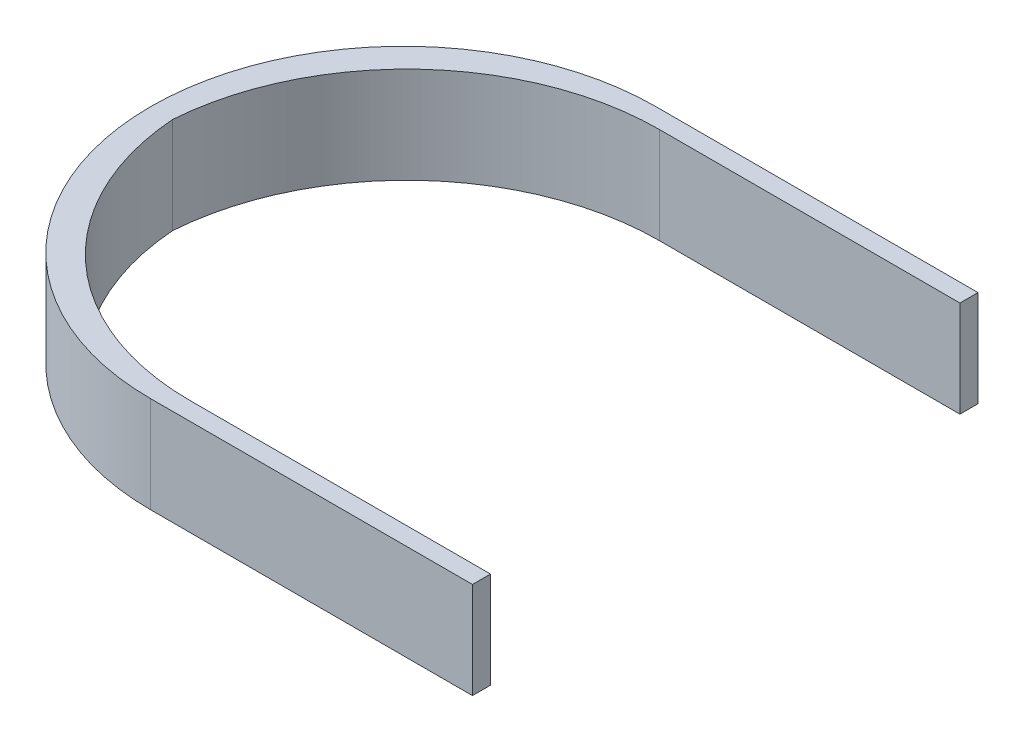
ISO-10303-21;
HEADER;
FILE_DESCRIPTION(('STEP AP214'),'2;1');
FILE_NAME('part.step','',(''),(''),'','','');
FILE_SCHEMA(('AUTOMOTIVE_DESIGN { 1 0 10303 214 1 1 1 1 }'));
ENDSEC;
DATA;
#1=APPLICATION_CONTEXT('core data for automotive mechanical design processes');
#2=APPLICATION_PROTOCOL_DEFINITION('international standard','automotive_design',2000,#1);
#3=PRODUCT_CONTEXT('',#1,'mechanical');
#4=PRODUCT('Part','Part','',(#3));
#5=PRODUCT_RELATED_PRODUCT_CATEGORY('part','',(#4));
#6=PRODUCT_DEFINITION_FORMATION('','',#4);
#7=PRODUCT_DEFINITION_CONTEXT('part definition',#1,'design');
#8=PRODUCT_DEFINITION('design','',#6,#7);
#9=PRODUCT_DEFINITION_SHAPE('','',#8);
#10=(LENGTH_UNIT() NAMED_UNIT(*) SI_UNIT(.MILLI.,.METRE.));
#11=(NAMED_UNIT(*) PLANE_ANGLE_UNIT() SI_UNIT($,.RADIAN.));
#12=(NAMED_UNIT(*) SI_UNIT($,.STERADIAN.) SOLID_ANGLE_UNIT());
#13=UNCERTAINTY_MEASURE_WITH_UNIT(LENGTH_MEASURE(1.E-05),#10,'distance_accuracy_value','');
#14=(GEOMETRIC_REPRESENTATION_CONTEXT(3) GLOBAL_UNCERTAINTY_ASSIGNED_CONTEXT((#13)) GLOBAL_UNIT_ASSIGNED_CONTEXT((#10,
#11,#12)) REPRESENTATION_CONTEXT('',''));
#15=CARTESIAN_POINT('',(0.,0.,0.));
#16=DIRECTION('',(0.,0.,1.));
#17=DIRECTION('',(1.,0.,0.));
#18=AXIS2_PLACEMENT_3D('',#15,#16,#17);
#19=CARTESIAN_POINT('',(0.,8.,0.));
#20=DIRECTION('',(0.,0.,-1.));
#21=DIRECTION('',(-1.,0.,0.));
#22=AXIS2_PLACEMENT_3D('',#19,#20,#21);
#23=PLANE('',#22);
#24=DIRECTION('',(1.,0.,0.));
#25=VECTOR('',#24,1.);
#26=CARTESIAN_POINT('',(0.,0.,0.));
#27=LINE('',#26,#25);
#28=CARTESIAN_POINT('',(21.,0.,0.));
#29=VERTEX_POINT('',#28);
#30=CARTESIAN_POINT('',(47.7496507037714,0.,0.));
#31=VERTEX_POINT('',#30);
#32=EDGE_CURVE('E153',#29,#31,#27,.T.);
#33=ORIENTED_EDGE('',*,*,#32,.T.);
#34=DIRECTION('',(0.,1.,0.));
#35=VECTOR('',#34,1.);
#36=CARTESIAN_POINT('',(47.7496507037714,8.,0.));
#37=LINE('',#36,#35);
#38=CARTESIAN_POINT('',(47.7496507037714,8.,0.));
#39=VERTEX_POINT('',#38);
#40=EDGE_CURVE('E123',#31,#39,#37,.T.);
#41=ORIENTED_EDGE('',*,*,#40,.T.);
#42=DIRECTION('',(1.,0.,0.));
#43=VECTOR('',#42,1.);
#44=CARTESIAN_POINT('',(0.,8.,0.));
#45=LINE('',#44,#43);
#46=CARTESIAN_POINT('',(21.,8.,0.));
#47=VERTEX_POINT('',#46);
#48=EDGE_CURVE('E142',#47,#39,#45,.T.);
#49=ORIENTED_EDGE('',*,*,#48,.F.);
#50=DIRECTION('',(0.,-1.,0.));
#51=VECTOR('',#50,1.);
#52=CARTESIAN_POINT('',(21.,0.,0.));
#53=LINE('',#52,#51);
#54=EDGE_CURVE('E162',#47,#29,#53,.T.);
#55=ORIENTED_EDGE('',*,*,#54,.T.);
#56=EDGE_LOOP('',(#33,#41,#49,#55));
#57=FACE_BOUND('',#56,.T.);
#58=ADVANCED_FACE('F39',(#57),#23,.F.);
#59=CARTESIAN_POINT('',(0.,8.,-42.));
#60=DIRECTION('',(0.,0.,-1.));
#61=DIRECTION('',(-1.,0.,0.));
#62=AXIS2_PLACEMENT_3D('',#59,#60,#61);
#63=PLANE('',#62);
#64=DIRECTION('',(0.,1.,0.));
#65=VECTOR('',#64,1.);
#66=CARTESIAN_POINT('',(47.7496507037714,8.,-42.));
#67=LINE('',#66,#65);
#68=CARTESIAN_POINT('',(47.7496507037714,0.,-42.));
#69=VERTEX_POINT('',#68);
#70=CARTESIAN_POINT('',(47.7496507037714,8.,-42.));
#71=VERTEX_POINT('',#70);
#72=EDGE_CURVE('E114',#69,#71,#67,.T.);
#73=ORIENTED_EDGE('',*,*,#72,.F.);
#74=DIRECTION('',(1.,0.,0.));
#75=VECTOR('',#74,1.);
#76=CARTESIAN_POINT('',(0.,0.,-42.));
#77=LINE('',#76,#75);
#78=CARTESIAN_POINT('',(21.,0.,-42.));
#79=VERTEX_POINT('',#78);
#80=EDGE_CURVE('E149',#79,#69,#77,.T.);
#81=ORIENTED_EDGE('',*,*,#80,.F.);
#82=DIRECTION('',(0.,-1.,0.));
#83=VECTOR('',#82,1.);
#84=CARTESIAN_POINT('',(21.,8.,-42.));
#85=LINE('',#84,#83);
#86=CARTESIAN_POINT('',(21.,8.,-42.));
#87=VERTEX_POINT('',#86);
#88=EDGE_CURVE('E139',#79,#87,#85,.F.);
#89=ORIENTED_EDGE('',*,*,#88,.T.);
#90=DIRECTION('',(1.,0.,0.));
#91=VECTOR('',#90,1.);
#92=CARTESIAN_POINT('',(0.,8.,-42.));
#93=LINE('',#92,#91);
#94=EDGE_CURVE('E130',#87,#71,#93,.T.);
#95=ORIENTED_EDGE('',*,*,#94,.T.);
#96=EDGE_LOOP('',(#73,#81,#89,#95));
#97=FACE_BOUND('',#96,.T.);
#98=ADVANCED_FACE('F137',(#97),#63,.T.);
#99=CARTESIAN_POINT('',(0.,8.,0.));
#100=DIRECTION('',(0.,1.,0.));
#101=DIRECTION('',(0.,0.,1.));
#102=AXIS2_PLACEMENT_3D('',#99,#100,#101);
#103=PLANE('',#102);
#104=DIRECTION('',(0.,0.,1.));
#105=VECTOR('',#104,1.);
#106=CARTESIAN_POINT('',(47.7496507037714,8.,-43.2267733965463));
#107=LINE('',#106,#105);
#108=CARTESIAN_POINT('',(47.7496507037714,8.,-40.5));
#109=VERTEX_POINT('',#108);
#110=EDGE_CURVE('E55',#71,#109,#107,.T.);
#111=ORIENTED_EDGE('',*,*,#110,.F.);
#112=ORIENTED_EDGE('',*,*,#94,.F.);
#113=CARTESIAN_POINT('',(21.,8.,-21.));
#114=DIRECTION('',(0.,1.,0.));
#115=DIRECTION('',(0.,0.,1.));
#116=AXIS2_PLACEMENT_3D('',#113,#114,#115);
#117=CIRCLE('',#116,21.);
#118=CARTESIAN_POINT('',(0.,8.,-21.));
#119=VERTEX_POINT('',#118);
#120=EDGE_CURVE('E195',#87,#119,#117,.T.);
#121=ORIENTED_EDGE('',*,*,#120,.T.);
#122=CARTESIAN_POINT('',(21.,8.,-21.));
#123=DIRECTION('',(0.,1.,0.));
#124=DIRECTION('',(0.,0.,1.));
#125=AXIS2_PLACEMENT_3D('',#122,#123,#124);
#126=CIRCLE('',#125,21.);
#127=EDGE_CURVE('E48',#119,#47,#126,.T.);
#128=ORIENTED_EDGE('',*,*,#127,.T.);
#129=ORIENTED_EDGE('',*,*,#48,.T.);
#130=CARTESIAN_POINT('',(47.7496507037714,8.,-1.5));
#131=VERTEX_POINT('',#130);
#132=EDGE_CURVE('E135',#131,#39,#107,.T.);
#133=ORIENTED_EDGE('',*,*,#132,.F.);
#134=DIRECTION('',(1.,0.,0.));
#135=VECTOR('',#134,1.);
#136=CARTESIAN_POINT('',(1.7857142857143,8.,-1.5));
#137=LINE('',#136,#135);
#138=CARTESIAN_POINT('',(22.7857142857143,8.,-1.5));
#139=VERTEX_POINT('',#138);
#140=EDGE_CURVE('E157',#139,#131,#137,.T.);
#141=ORIENTED_EDGE('',*,*,#140,.F.);
#142=CARTESIAN_POINT('',(22.7857142857143,8.,-22.5));
#143=DIRECTION('',(0.,1.,0.));
#144=DIRECTION('',(0.,0.,1.));
#145=AXIS2_PLACEMENT_3D('',#142,#143,#144);
#146=CIRCLE('',#145,21.);
#147=CARTESIAN_POINT('',(1.83935422006089,8.,-21.));
#148=VERTEX_POINT('',#147);
#149=EDGE_CURVE('E180',#139,#148,#146,.F.);
#150=ORIENTED_EDGE('',*,*,#149,.T.);
#151=CARTESIAN_POINT('',(22.7857142857143,8.,-19.5));
#152=DIRECTION('',(0.,1.,0.));
#153=DIRECTION('',(0.,0.,1.));
#154=AXIS2_PLACEMENT_3D('',#151,#152,#153);
#155=CIRCLE('',#154,21.);
#156=CARTESIAN_POINT('',(22.7857142857143,8.,-40.5));
#157=VERTEX_POINT('',#156);
#158=EDGE_CURVE('E186',#148,#157,#155,.F.);
#159=ORIENTED_EDGE('',*,*,#158,.T.);
#160=DIRECTION('',(1.,0.,0.));
#161=VECTOR('',#160,1.);
#162=CARTESIAN_POINT('',(1.7857142857143,8.,-40.5));
#163=LINE('',#162,#161);
#164=EDGE_CURVE('E133',#157,#109,#163,.T.);
#165=ORIENTED_EDGE('',*,*,#164,.T.);
#166=EDGE_LOOP('',(#111,#112,#121,#128,#129,#133,#141,#150,#159,#165));
#167=FACE_BOUND('',#166,.T.);
#168=ADVANCED_FACE('F129',(#167),#103,.T.);
#169=CARTESIAN_POINT('',(0.,0.,0.));
#170=DIRECTION('',(0.,1.,0.));
#171=DIRECTION('',(0.,0.,1.));
#172=AXIS2_PLACEMENT_3D('',#169,#170,#171);
#173=PLANE('',#172);
#174=ORIENTED_EDGE('',*,*,#80,.T.);
#175=DIRECTION('',(0.,0.,1.));
#176=VECTOR('',#175,1.);
#177=CARTESIAN_POINT('',(47.7496507037714,0.,-43.2267733965463));
#178=LINE('',#177,#176);
#179=CARTESIAN_POINT('',(47.7496507037714,0.,-40.5));
#180=VERTEX_POINT('',#179);
#181=EDGE_CURVE('E117',#69,#180,#178,.T.);
#182=ORIENTED_EDGE('',*,*,#181,.T.);
#183=DIRECTION('',(-1.,0.,0.));
#184=VECTOR('',#183,1.);
#185=CARTESIAN_POINT('',(0.,0.,-40.5));
#186=LINE('',#185,#184);
#187=CARTESIAN_POINT('',(22.7857142857143,0.,-40.5));
#188=VERTEX_POINT('',#187);
#189=EDGE_CURVE('E146',#180,#188,#186,.T.);
#190=ORIENTED_EDGE('',*,*,#189,.T.);
#191=CARTESIAN_POINT('',(22.7857142857143,0.,-19.5));
#192=DIRECTION('',(0.,1.,0.));
#193=DIRECTION('',(0.,0.,1.));
#194=AXIS2_PLACEMENT_3D('',#191,#192,#193);
#195=CIRCLE('',#194,21.);
#196=CARTESIAN_POINT('',(1.83935422006089,0.,-21.));
#197=VERTEX_POINT('',#196);
#198=EDGE_CURVE('E183',#188,#197,#195,.T.);
#199=ORIENTED_EDGE('',*,*,#198,.T.);
#200=CARTESIAN_POINT('',(22.7857142857143,0.,-22.5));
#201=DIRECTION('',(0.,1.,0.));
#202=DIRECTION('',(0.,0.,1.));
#203=AXIS2_PLACEMENT_3D('',#200,#201,#202);
#204=CIRCLE('',#203,21.);
#205=CARTESIAN_POINT('',(22.7857142857143,0.,-1.5));
#206=VERTEX_POINT('',#205);
#207=EDGE_CURVE('E176',#197,#206,#204,.T.);
#208=ORIENTED_EDGE('',*,*,#207,.T.);
#209=DIRECTION('',(-1.,0.,0.));
#210=VECTOR('',#209,1.);
#211=CARTESIAN_POINT('',(0.,0.,-1.5));
#212=LINE('',#211,#210);
#213=CARTESIAN_POINT('',(47.7496507037714,0.,-1.5));
#214=VERTEX_POINT('',#213);
#215=EDGE_CURVE('E141',#214,#206,#212,.T.);
#216=ORIENTED_EDGE('',*,*,#215,.F.);
#217=EDGE_CURVE('E62',#214,#31,#178,.T.);
#218=ORIENTED_EDGE('',*,*,#217,.T.);
#219=ORIENTED_EDGE('',*,*,#32,.F.);
#220=CARTESIAN_POINT('',(21.,0.,-21.));
#221=DIRECTION('',(0.,1.,0.));
#222=DIRECTION('',(0.,0.,1.));
#223=AXIS2_PLACEMENT_3D('',#220,#221,#222);
#224=CIRCLE('',#223,21.);
#225=CARTESIAN_POINT('',(0.,0.,-21.));
#226=VERTEX_POINT('',#225);
#227=EDGE_CURVE('E192',#29,#226,#224,.F.);
#228=ORIENTED_EDGE('',*,*,#227,.T.);
#229=CARTESIAN_POINT('',(21.,0.,-21.));
#230=DIRECTION('',(0.,1.,0.));
#231=DIRECTION('',(0.,0.,1.));
#232=AXIS2_PLACEMENT_3D('',#229,#230,#231);
#233=CIRCLE('',#232,21.);
#234=EDGE_CURVE('E189',#226,#79,#233,.F.);
#235=ORIENTED_EDGE('',*,*,#234,.T.);
#236=EDGE_LOOP('',(#174,#182,#190,#199,#208,#216,#218,#219,#228,#235));
#237=FACE_BOUND('',#236,.T.);
#238=ADVANCED_FACE('F235',(#237),#173,.F.);
#239=CARTESIAN_POINT('',(1.7857142857143,8.,-40.5));
#240=DIRECTION('',(0.,0.,-1.));
#241=DIRECTION('',(-1.,0.,0.));
#242=AXIS2_PLACEMENT_3D('',#239,#240,#241);
#243=PLANE('',#242);
#244=ORIENTED_EDGE('',*,*,#189,.F.);
#245=DIRECTION('',(0.,1.,0.));
#246=VECTOR('',#245,1.);
#247=CARTESIAN_POINT('',(47.7496507037714,8.,-40.5));
#248=LINE('',#247,#246);
#249=EDGE_CURVE('E124',#180,#109,#248,.T.);
#250=ORIENTED_EDGE('',*,*,#249,.T.);
#251=ORIENTED_EDGE('',*,*,#164,.F.);
#252=DIRECTION('',(0.,-1.,0.));
#253=VECTOR('',#252,1.);
#254=CARTESIAN_POINT('',(22.7857142857143,8.,-40.5));
#255=LINE('',#254,#253);
#256=EDGE_CURVE('E170',#157,#188,#255,.T.);
#257=ORIENTED_EDGE('',*,*,#256,.T.);
#258=EDGE_LOOP('',(#244,#250,#251,#257));
#259=FACE_BOUND('',#258,.T.);
#260=ADVANCED_FACE('F251',(#259),#243,.F.);
#261=CARTESIAN_POINT('',(1.7857142857143,8.,-1.5));
#262=DIRECTION('',(0.,0.,-1.));
#263=DIRECTION('',(-1.,0.,0.));
#264=AXIS2_PLACEMENT_3D('',#261,#262,#263);
#265=PLANE('',#264);
#266=DIRECTION('',(0.,1.,0.));
#267=VECTOR('',#266,1.);
#268=CARTESIAN_POINT('',(47.7496507037714,8.,-1.5));
#269=LINE('',#268,#267);
#270=EDGE_CURVE('E11',#214,#131,#269,.T.);
#271=ORIENTED_EDGE('',*,*,#270,.F.);
#272=ORIENTED_EDGE('',*,*,#215,.T.);
#273=DIRECTION('',(0.,-1.,0.));
#274=VECTOR('',#273,1.);
#275=CARTESIAN_POINT('',(22.7857142857143,8.,-1.5));
#276=LINE('',#275,#274);
#277=EDGE_CURVE('E166',#206,#139,#276,.F.);
#278=ORIENTED_EDGE('',*,*,#277,.T.);
#279=ORIENTED_EDGE('',*,*,#140,.T.);
#280=EDGE_LOOP('',(#271,#272,#278,#279));
#281=FACE_BOUND('',#280,.T.);
#282=ADVANCED_FACE('F221',(#281),#265,.T.);
#283=CARTESIAN_POINT('',(21.,8.,-21.));
#284=DIRECTION('',(0.,-1.,0.));
#285=DIRECTION('',(0.,0.,-1.));
#286=AXIS2_PLACEMENT_3D('',#283,#284,#285);
#287=CYLINDRICAL_SURFACE('',#286,21.);
#288=DIRECTION('',(0.,-1.,0.));
#289=VECTOR('',#288,1.);
#290=CARTESIAN_POINT('',(0.,8.,-21.));
#291=LINE('',#290,#289);
#292=EDGE_CURVE('E200',#119,#226,#291,.T.);
#293=ORIENTED_EDGE('',*,*,#292,.F.);
#294=ORIENTED_EDGE('',*,*,#120,.F.);
#295=ORIENTED_EDGE('',*,*,#88,.F.);
#296=ORIENTED_EDGE('',*,*,#234,.F.);
#297=EDGE_LOOP('',(#293,#294,#295,#296));
#298=FACE_BOUND('',#297,.T.);
#299=ADVANCED_FACE('F243',(#298),#287,.T.);
#300=CARTESIAN_POINT('',(21.,8.,-21.));
#301=DIRECTION('',(0.,1.,0.));
#302=DIRECTION('',(0.,0.,1.));
#303=AXIS2_PLACEMENT_3D('',#300,#301,#302);
#304=CYLINDRICAL_SURFACE('',#303,21.);
#305=ORIENTED_EDGE('',*,*,#127,.F.);
#306=ORIENTED_EDGE('',*,*,#292,.T.);
#307=ORIENTED_EDGE('',*,*,#227,.F.);
#308=ORIENTED_EDGE('',*,*,#54,.F.);
#309=EDGE_LOOP('',(#305,#306,#307,#308));
#310=FACE_BOUND('',#309,.T.);
#311=ADVANCED_FACE('F239',(#310),#304,.T.);
#312=CARTESIAN_POINT('',(22.7857142857143,8.,-19.5));
#313=DIRECTION('',(0.,-1.,0.));
#314=DIRECTION('',(0.,0.,-1.));
#315=AXIS2_PLACEMENT_3D('',#312,#313,#314);
#316=CYLINDRICAL_SURFACE('',#315,21.);
#317=ORIENTED_EDGE('',*,*,#256,.F.);
#318=ORIENTED_EDGE('',*,*,#158,.F.);
#319=DIRECTION('',(0.,-1.,0.));
#320=VECTOR('',#319,1.);
#321=CARTESIAN_POINT('',(1.83935422006089,4.,-21.));
#322=LINE('',#321,#320);
#323=EDGE_CURVE('E203',#197,#148,#322,.F.);
#324=ORIENTED_EDGE('',*,*,#323,.F.);
#325=ORIENTED_EDGE('',*,*,#198,.F.);
#326=EDGE_LOOP('',(#317,#318,#324,#325));
#327=FACE_BOUND('',#326,.T.);
#328=ADVANCED_FACE('F41',(#327),#316,.F.);
#329=CARTESIAN_POINT('',(22.7857142857143,8.,-22.5));
#330=DIRECTION('',(0.,1.,0.));
#331=DIRECTION('',(0.,0.,1.));
#332=AXIS2_PLACEMENT_3D('',#329,#330,#331);
#333=CYLINDRICAL_SURFACE('',#332,21.);
#334=ORIENTED_EDGE('',*,*,#149,.F.);
#335=ORIENTED_EDGE('',*,*,#277,.F.);
#336=ORIENTED_EDGE('',*,*,#207,.F.);
#337=ORIENTED_EDGE('',*,*,#323,.T.);
#338=EDGE_LOOP('',(#334,#335,#336,#337));
#339=FACE_BOUND('',#338,.T.);
#340=ADVANCED_FACE('F268',(#339),#333,.F.);
#341=CARTESIAN_POINT('',(47.7496507037714,0.,-43.2267733965463));
#342=DIRECTION('',(-1.,0.,0.));
#343=DIRECTION('',(0.,0.,1.));
#344=AXIS2_PLACEMENT_3D('',#341,#342,#343);
#345=PLANE('',#344);
#346=ORIENTED_EDGE('',*,*,#217,.F.);
#347=ORIENTED_EDGE('',*,*,#270,.T.);
#348=ORIENTED_EDGE('',*,*,#132,.T.);
#349=ORIENTED_EDGE('',*,*,#40,.F.);
#350=EDGE_LOOP('',(#346,#347,#348,#349));
#351=FACE_BOUND('',#350,.T.);
#352=ADVANCED_FACE('F266',(#351),#345,.F.);
#353=ORIENTED_EDGE('',*,*,#72,.T.);
#354=ORIENTED_EDGE('',*,*,#110,.T.);
#355=ORIENTED_EDGE('',*,*,#249,.F.);
#356=ORIENTED_EDGE('',*,*,#181,.F.);
#357=EDGE_LOOP('',(#353,#354,#355,#356));
#358=FACE_BOUND('',#357,.T.);
#359=ADVANCED_FACE('F115',(#358),#345,.F.);
#360=CLOSED_SHELL('',(#58,#98,#168,#238,#260,#282,#299,#311,#328,#340,#352,#359));
#361=MANIFOLD_SOLID_BREP('B2',#360);
#362=ADVANCED_BREP_SHAPE_REPRESENTATION('',(#18,#361),#14);
#363=SHAPE_DEFINITION_REPRESENTATION(#9,#362);
ENDSEC;
END-ISO-10303-21;
